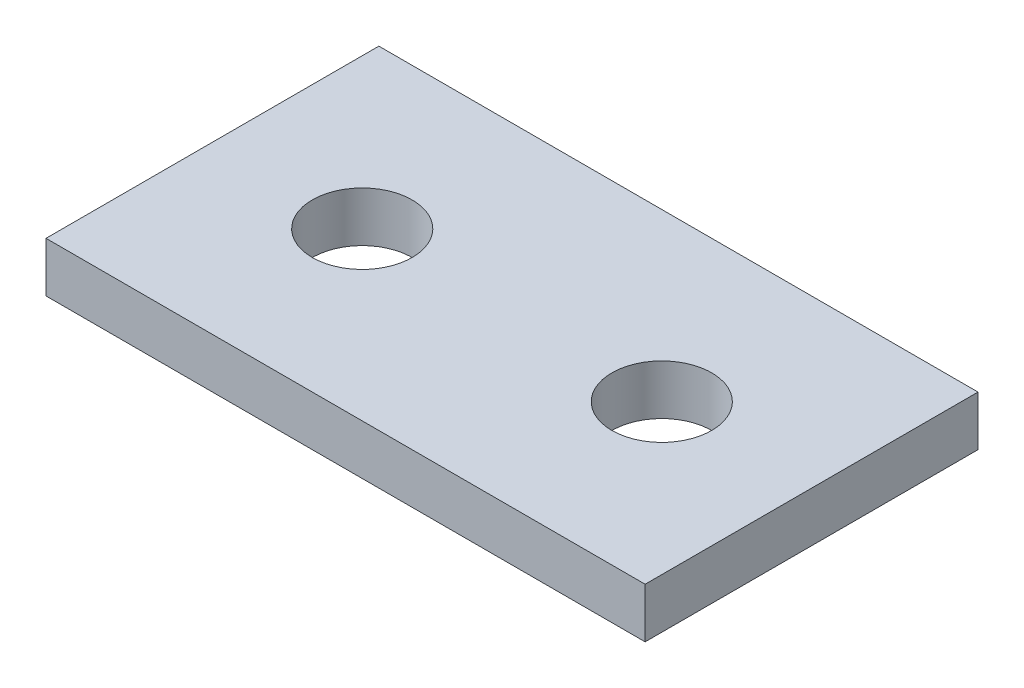
ISO-10303-21;
HEADER;
FILE_DESCRIPTION(('STEP AP214'),'2;1');
FILE_NAME('part.step','',(''),(''),'','','');
FILE_SCHEMA(('AUTOMOTIVE_DESIGN { 1 0 10303 214 1 1 1 1 }'));
ENDSEC;
DATA;
#1=APPLICATION_CONTEXT('core data for automotive mechanical design processes');
#2=APPLICATION_PROTOCOL_DEFINITION('international standard','automotive_design',2000,#1);
#3=PRODUCT_CONTEXT('',#1,'mechanical');
#4=PRODUCT('Part','Part','',(#3));
#5=PRODUCT_RELATED_PRODUCT_CATEGORY('part','',(#4));
#6=PRODUCT_DEFINITION_FORMATION('','',#4);
#7=PRODUCT_DEFINITION_CONTEXT('part definition',#1,'design');
#8=PRODUCT_DEFINITION('design','',#6,#7);
#9=PRODUCT_DEFINITION_SHAPE('','',#8);
#10=(LENGTH_UNIT() NAMED_UNIT(*) SI_UNIT(.MILLI.,.METRE.));
#11=(NAMED_UNIT(*) PLANE_ANGLE_UNIT() SI_UNIT($,.RADIAN.));
#12=(NAMED_UNIT(*) SI_UNIT($,.STERADIAN.) SOLID_ANGLE_UNIT());
#13=UNCERTAINTY_MEASURE_WITH_UNIT(LENGTH_MEASURE(1.E-05),#10,'distance_accuracy_value','');
#14=(GEOMETRIC_REPRESENTATION_CONTEXT(3) GLOBAL_UNCERTAINTY_ASSIGNED_CONTEXT((#13)) GLOBAL_UNIT_ASSIGNED_CONTEXT((#10,
#11,#12)) REPRESENTATION_CONTEXT('',''));
#15=CARTESIAN_POINT('',(0.,0.,0.));
#16=DIRECTION('',(0.,0.,1.));
#17=DIRECTION('',(1.,0.,0.));
#18=AXIS2_PLACEMENT_3D('',#15,#16,#17);
#19=CARTESIAN_POINT('',(0.,9.525,0.));
#20=DIRECTION('',(1.,0.,0.));
#21=DIRECTION('',(0.,0.,-1.));
#22=AXIS2_PLACEMENT_3D('',#19,#20,#21);
#23=PLANE('',#22);
#24=DIRECTION('',(0.,0.,1.));
#25=VECTOR('',#24,1.);
#26=CARTESIAN_POINT('',(0.,0.,0.));
#27=LINE('',#26,#25);
#28=CARTESIAN_POINT('',(0.,0.,0.));
#29=VERTEX_POINT('',#28);
#30=CARTESIAN_POINT('',(0.,0.,63.5));
#31=VERTEX_POINT('',#30);
#32=EDGE_CURVE('E97',#29,#31,#27,.T.);
#33=ORIENTED_EDGE('',*,*,#32,.T.);
#34=DIRECTION('',(0.,-1.,0.));
#35=VECTOR('',#34,1.);
#36=CARTESIAN_POINT('',(0.,9.525,63.5));
#37=LINE('',#36,#35);
#38=CARTESIAN_POINT('',(0.,9.525,63.5));
#39=VERTEX_POINT('',#38);
#40=EDGE_CURVE('E11',#39,#31,#37,.T.);
#41=ORIENTED_EDGE('',*,*,#40,.F.);
#42=DIRECTION('',(0.,0.,1.));
#43=VECTOR('',#42,1.);
#44=CARTESIAN_POINT('',(0.,9.525,0.));
#45=LINE('',#44,#43);
#46=CARTESIAN_POINT('',(0.,9.525,0.));
#47=VERTEX_POINT('',#46);
#48=EDGE_CURVE('E85',#47,#39,#45,.T.);
#49=ORIENTED_EDGE('',*,*,#48,.F.);
#50=DIRECTION('',(0.,-1.,0.));
#51=VECTOR('',#50,1.);
#52=CARTESIAN_POINT('',(0.,9.525,0.));
#53=LINE('',#52,#51);
#54=EDGE_CURVE('E93',#47,#29,#53,.T.);
#55=ORIENTED_EDGE('',*,*,#54,.T.);
#56=EDGE_LOOP('',(#33,#41,#49,#55));
#57=FACE_BOUND('',#56,.T.);
#58=ADVANCED_FACE('F34',(#57),#23,.F.);
#59=CARTESIAN_POINT('',(0.,9.525,63.5));
#60=DIRECTION('',(0.,0.,-1.));
#61=DIRECTION('',(-1.,0.,0.));
#62=AXIS2_PLACEMENT_3D('',#59,#60,#61);
#63=PLANE('',#62);
#64=DIRECTION('',(1.,0.,0.));
#65=VECTOR('',#64,1.);
#66=CARTESIAN_POINT('',(0.,0.,63.5));
#67=LINE('',#66,#65);
#68=CARTESIAN_POINT('',(114.3,0.,63.5));
#69=VERTEX_POINT('',#68);
#70=EDGE_CURVE('E89',#31,#69,#67,.T.);
#71=ORIENTED_EDGE('',*,*,#70,.T.);
#72=DIRECTION('',(0.,-1.,0.));
#73=VECTOR('',#72,1.);
#74=CARTESIAN_POINT('',(114.3,9.525,63.5));
#75=LINE('',#74,#73);
#76=CARTESIAN_POINT('',(114.3,9.525,63.5));
#77=VERTEX_POINT('',#76);
#78=EDGE_CURVE('E42',#77,#69,#75,.T.);
#79=ORIENTED_EDGE('',*,*,#78,.F.);
#80=DIRECTION('',(1.,0.,0.));
#81=VECTOR('',#80,1.);
#82=CARTESIAN_POINT('',(0.,9.525,63.5));
#83=LINE('',#82,#81);
#84=EDGE_CURVE('E80',#39,#77,#83,.T.);
#85=ORIENTED_EDGE('',*,*,#84,.F.);
#86=ORIENTED_EDGE('',*,*,#40,.T.);
#87=EDGE_LOOP('',(#71,#79,#85,#86));
#88=FACE_BOUND('',#87,.T.);
#89=ADVANCED_FACE('F88',(#88),#63,.F.);
#90=CARTESIAN_POINT('',(114.3,9.525,0.));
#91=DIRECTION('',(-1.,0.,0.));
#92=DIRECTION('',(0.,0.,1.));
#93=AXIS2_PLACEMENT_3D('',#90,#91,#92);
#94=PLANE('',#93);
#95=DIRECTION('',(0.,0.,-1.));
#96=VECTOR('',#95,1.);
#97=CARTESIAN_POINT('',(114.3,0.,0.));
#98=LINE('',#97,#96);
#99=CARTESIAN_POINT('',(114.3,0.,0.));
#100=VERTEX_POINT('',#99);
#101=EDGE_CURVE('E67',#69,#100,#98,.T.);
#102=ORIENTED_EDGE('',*,*,#101,.T.);
#103=DIRECTION('',(0.,-1.,0.));
#104=VECTOR('',#103,1.);
#105=CARTESIAN_POINT('',(114.3,9.525,0.));
#106=LINE('',#105,#104);
#107=CARTESIAN_POINT('',(114.3,9.525,0.));
#108=VERTEX_POINT('',#107);
#109=EDGE_CURVE('E90',#108,#100,#106,.T.);
#110=ORIENTED_EDGE('',*,*,#109,.F.);
#111=DIRECTION('',(0.,0.,-1.));
#112=VECTOR('',#111,1.);
#113=CARTESIAN_POINT('',(114.3,9.525,0.));
#114=LINE('',#113,#112);
#115=EDGE_CURVE('E83',#77,#108,#114,.T.);
#116=ORIENTED_EDGE('',*,*,#115,.F.);
#117=ORIENTED_EDGE('',*,*,#78,.T.);
#118=EDGE_LOOP('',(#102,#110,#116,#117));
#119=FACE_BOUND('',#118,.T.);
#120=ADVANCED_FACE('F91',(#119),#94,.F.);
#121=CARTESIAN_POINT('',(0.,9.525,0.));
#122=DIRECTION('',(0.,0.,1.));
#123=DIRECTION('',(1.,0.,0.));
#124=AXIS2_PLACEMENT_3D('',#121,#122,#123);
#125=PLANE('',#124);
#126=DIRECTION('',(-1.,0.,0.));
#127=VECTOR('',#126,1.);
#128=CARTESIAN_POINT('',(0.,0.,0.));
#129=LINE('',#128,#127);
#130=EDGE_CURVE('E73',#100,#29,#129,.T.);
#131=ORIENTED_EDGE('',*,*,#130,.T.);
#132=ORIENTED_EDGE('',*,*,#54,.F.);
#133=DIRECTION('',(-1.,0.,0.));
#134=VECTOR('',#133,1.);
#135=CARTESIAN_POINT('',(0.,9.525,0.));
#136=LINE('',#135,#134);
#137=EDGE_CURVE('E50',#108,#47,#136,.T.);
#138=ORIENTED_EDGE('',*,*,#137,.F.);
#139=ORIENTED_EDGE('',*,*,#109,.T.);
#140=EDGE_LOOP('',(#131,#132,#138,#139));
#141=FACE_BOUND('',#140,.T.);
#142=ADVANCED_FACE('F105',(#141),#125,.F.);
#143=CARTESIAN_POINT('',(0.,9.525,0.));
#144=DIRECTION('',(0.,1.,0.));
#145=DIRECTION('',(0.,0.,1.));
#146=AXIS2_PLACEMENT_3D('',#143,#144,#145);
#147=PLANE('',#146);
#148=CARTESIAN_POINT('',(85.725,9.525,31.75));
#149=DIRECTION('',(0.,1.,0.));
#150=DIRECTION('',(0.,0.,-1.));
#151=AXIS2_PLACEMENT_3D('',#148,#149,#150);
#152=CIRCLE('',#151,9.52499999999999);
#153=CARTESIAN_POINT('',(85.725,9.525,41.275));
#154=VERTEX_POINT('',#153);
#155=EDGE_CURVE('E117',#154,#154,#152,.T.);
#156=ORIENTED_EDGE('',*,*,#155,.F.);
#157=EDGE_LOOP('',(#156));
#158=FACE_BOUND('',#157,.T.);
#159=CARTESIAN_POINT('',(28.575,9.525,31.75));
#160=DIRECTION('',(0.,1.,0.));
#161=DIRECTION('',(0.,0.,1.));
#162=AXIS2_PLACEMENT_3D('',#159,#160,#161);
#163=CIRCLE('',#162,9.525);
#164=CARTESIAN_POINT('',(28.575,9.525,41.275));
#165=VERTEX_POINT('',#164);
#166=EDGE_CURVE('E111',#165,#165,#163,.T.);
#167=ORIENTED_EDGE('',*,*,#166,.F.);
#168=EDGE_LOOP('',(#167));
#169=FACE_BOUND('',#168,.T.);
#170=ORIENTED_EDGE('',*,*,#48,.T.);
#171=ORIENTED_EDGE('',*,*,#84,.T.);
#172=ORIENTED_EDGE('',*,*,#115,.T.);
#173=ORIENTED_EDGE('',*,*,#137,.T.);
#174=EDGE_LOOP('',(#170,#171,#172,#173));
#175=FACE_BOUND('',#174,.T.);
#176=ADVANCED_FACE('F81',(#158,#169,#175),#147,.T.);
#177=CARTESIAN_POINT('',(0.,0.,0.));
#178=DIRECTION('',(0.,1.,0.));
#179=DIRECTION('',(0.,0.,1.));
#180=AXIS2_PLACEMENT_3D('',#177,#178,#179);
#181=PLANE('',#180);
#182=CARTESIAN_POINT('',(85.725,0.,31.75));
#183=DIRECTION('',(0.,1.,0.));
#184=DIRECTION('',(0.,0.,-1.));
#185=AXIS2_PLACEMENT_3D('',#182,#183,#184);
#186=CIRCLE('',#185,9.52499999999999);
#187=CARTESIAN_POINT('',(85.725,0.,41.275));
#188=VERTEX_POINT('',#187);
#189=EDGE_CURVE('E114',#188,#188,#186,.T.);
#190=ORIENTED_EDGE('',*,*,#189,.T.);
#191=EDGE_LOOP('',(#190));
#192=FACE_BOUND('',#191,.T.);
#193=CARTESIAN_POINT('',(28.575,0.,31.75));
#194=DIRECTION('',(0.,1.,0.));
#195=DIRECTION('',(0.,0.,1.));
#196=AXIS2_PLACEMENT_3D('',#193,#194,#195);
#197=CIRCLE('',#196,9.525);
#198=CARTESIAN_POINT('',(28.575,0.,41.275));
#199=VERTEX_POINT('',#198);
#200=EDGE_CURVE('E100',#199,#199,#197,.T.);
#201=ORIENTED_EDGE('',*,*,#200,.T.);
#202=EDGE_LOOP('',(#201));
#203=FACE_BOUND('',#202,.T.);
#204=ORIENTED_EDGE('',*,*,#32,.F.);
#205=ORIENTED_EDGE('',*,*,#130,.F.);
#206=ORIENTED_EDGE('',*,*,#101,.F.);
#207=ORIENTED_EDGE('',*,*,#70,.F.);
#208=EDGE_LOOP('',(#204,#205,#206,#207));
#209=FACE_BOUND('',#208,.T.);
#210=ADVANCED_FACE('F108',(#192,#203,#209),#181,.F.);
#211=CARTESIAN_POINT('',(28.575,0.,31.75));
#212=DIRECTION('',(0.,1.,0.));
#213=DIRECTION('',(0.,0.,1.));
#214=AXIS2_PLACEMENT_3D('',#211,#212,#213);
#215=CYLINDRICAL_SURFACE('',#214,9.525);
#216=CARTESIAN_POINT('',(28.575,0.,41.275));
#217=CARTESIAN_POINT('',(28.575,0.0992187499999999,41.275));
#218=CARTESIAN_POINT('',(28.575,0.1984375,41.275));
#219=CARTESIAN_POINT('',(28.575,0.396875,41.275));
#220=CARTESIAN_POINT('',(28.575,0.49609375,41.275));
#221=CARTESIAN_POINT('',(28.575,0.69453125,41.275));
#222=CARTESIAN_POINT('',(28.575,0.79375,41.275));
#223=CARTESIAN_POINT('',(28.575,0.9921875,41.275));
#224=CARTESIAN_POINT('',(28.575,1.09140625,41.275));
#225=CARTESIAN_POINT('',(28.575,1.28984375,41.275));
#226=CARTESIAN_POINT('',(28.575,1.3890625,41.275));
#227=CARTESIAN_POINT('',(28.575,1.5875,41.275));
#228=CARTESIAN_POINT('',(28.575,1.68671875,41.275));
#229=CARTESIAN_POINT('',(28.575,1.88515625,41.275));
#230=CARTESIAN_POINT('',(28.575,1.984375,41.275));
#231=CARTESIAN_POINT('',(28.575,2.1828125,41.275));
#232=CARTESIAN_POINT('',(28.575,2.28203125,41.275));
#233=CARTESIAN_POINT('',(28.575,2.48046875,41.275));
#234=CARTESIAN_POINT('',(28.575,2.5796875,41.275));
#235=CARTESIAN_POINT('',(28.575,2.778125,41.275));
#236=CARTESIAN_POINT('',(28.575,2.87734375,41.275));
#237=CARTESIAN_POINT('',(28.575,3.07578125,41.275));
#238=CARTESIAN_POINT('',(28.575,3.175,41.275));
#239=CARTESIAN_POINT('',(28.575,3.3734375,41.275));
#240=CARTESIAN_POINT('',(28.575,3.47265625,41.275));
#241=CARTESIAN_POINT('',(28.575,3.67109375,41.275));
#242=CARTESIAN_POINT('',(28.575,3.7703125,41.275));
#243=CARTESIAN_POINT('',(28.575,3.96875,41.275));
#244=CARTESIAN_POINT('',(28.575,4.06796875,41.275));
#245=CARTESIAN_POINT('',(28.575,4.26640625,41.275));
#246=CARTESIAN_POINT('',(28.575,4.365625,41.275));
#247=CARTESIAN_POINT('',(28.575,4.5640625,41.275));
#248=CARTESIAN_POINT('',(28.575,4.66328125,41.275));
#249=CARTESIAN_POINT('',(28.575,4.86171875,41.275));
#250=CARTESIAN_POINT('',(28.575,4.9609375,41.275));
#251=CARTESIAN_POINT('',(28.575,5.159375,41.275));
#252=CARTESIAN_POINT('',(28.575,5.25859375,41.275));
#253=CARTESIAN_POINT('',(28.575,5.45703125,41.275));
#254=CARTESIAN_POINT('',(28.575,5.55625,41.275));
#255=CARTESIAN_POINT('',(28.575,5.7546875,41.275));
#256=CARTESIAN_POINT('',(28.575,5.85390625,41.275));
#257=CARTESIAN_POINT('',(28.575,6.05234375,41.275));
#258=CARTESIAN_POINT('',(28.575,6.1515625,41.275));
#259=CARTESIAN_POINT('',(28.575,6.35,41.275));
#260=CARTESIAN_POINT('',(28.575,6.44921875,41.275));
#261=CARTESIAN_POINT('',(28.575,6.64765625,41.275));
#262=CARTESIAN_POINT('',(28.575,6.746875,41.275));
#263=CARTESIAN_POINT('',(28.575,6.9453125,41.275));
#264=CARTESIAN_POINT('',(28.575,7.04453125,41.275));
#265=CARTESIAN_POINT('',(28.575,7.24296875,41.275));
#266=CARTESIAN_POINT('',(28.575,7.3421875,41.275));
#267=CARTESIAN_POINT('',(28.575,7.540625,41.275));
#268=CARTESIAN_POINT('',(28.575,7.63984375,41.275));
#269=CARTESIAN_POINT('',(28.575,7.83828125,41.275));
#270=CARTESIAN_POINT('',(28.575,7.9375,41.275));
#271=CARTESIAN_POINT('',(28.575,8.1359375,41.275));
#272=CARTESIAN_POINT('',(28.575,8.23515625,41.275));
#273=CARTESIAN_POINT('',(28.575,8.43359375,41.275));
#274=CARTESIAN_POINT('',(28.575,8.5328125,41.275));
#275=CARTESIAN_POINT('',(28.575,8.73125,41.275));
#276=CARTESIAN_POINT('',(28.575,8.83046875,41.275));
#277=CARTESIAN_POINT('',(28.575,9.02890625,41.275));
#278=CARTESIAN_POINT('',(28.575,9.128125,41.275));
#279=CARTESIAN_POINT('',(28.575,9.3265625,41.275));
#280=CARTESIAN_POINT('',(28.575,9.42578125,41.275));
#281=CARTESIAN_POINT('',(28.575,9.525,41.275));
#282=B_SPLINE_CURVE_WITH_KNOTS('',3,(#216,#217,#218,#219,#220,#221,#222,#223,#224,#225,#226,
#227,#228,#229,#230,#231,#232,#233,#234,#235,#236,#237,#238,#239,#240,#241,#242,#243,#244,#245,
#246,#247,#248,#249,#250,#251,#252,#253,#254,#255,#256,#257,#258,#259,#260,#261,#262,#263,#264,
#265,#266,#267,#268,#269,#270,#271,#272,#273,#274,#275,#276,#277,#278,#279,#280,#281),
.UNSPECIFIED.,.F.,.F.,(4,2,2,2,2,2,2,2,2,2,2,2,2,2,2,2,2,2,2,2,2,2,2,2,2,2,2,2,2,2,2,2,4),(0.,
0.29765625,0.5953125,0.89296875,1.190625,1.48828125,1.7859375,2.08359375,2.38125,2.67890625,
2.9765625,3.27421875,3.571875,3.86953125,4.1671875,4.46484375,4.7625,5.06015625,5.3578125,
5.65546875,5.953125,6.25078125,6.5484375,6.84609375,7.14375,7.44140625,7.7390625,8.03671875,
8.334375,8.63203125,8.9296875,9.22734375,9.525),.UNSPECIFIED.);
#283=EDGE_CURVE('BSEAM128',#199,#165,#282,.T.);
#284=ORIENTED_EDGE('',*,*,#200,.F.);
#285=ORIENTED_EDGE('',*,*,#166,.T.);
#286=ORIENTED_EDGE('',*,*,#283,.T.);
#287=ORIENTED_EDGE('',*,*,#283,.F.);
#288=EDGE_LOOP('',(#284,#286,#285,#287));
#289=FACE_BOUND('',#288,.T.);
#290=ADVANCED_FACE('F128',(#289),#215,.F.);
#291=CARTESIAN_POINT('',(85.725,0.,31.75));
#292=DIRECTION('',(0.,1.,0.));
#293=DIRECTION('',(0.,0.,1.));
#294=AXIS2_PLACEMENT_3D('',#291,#292,#293);
#295=CYLINDRICAL_SURFACE('',#294,9.52499999999999);
#296=CARTESIAN_POINT('',(85.725,0.,41.275));
#297=CARTESIAN_POINT('',(85.725,0.0992187499999999,41.275));
#298=CARTESIAN_POINT('',(85.725,0.1984375,41.275));
#299=CARTESIAN_POINT('',(85.725,0.396875,41.275));
#300=CARTESIAN_POINT('',(85.725,0.49609375,41.275));
#301=CARTESIAN_POINT('',(85.725,0.69453125,41.275));
#302=CARTESIAN_POINT('',(85.725,0.79375,41.275));
#303=CARTESIAN_POINT('',(85.725,0.9921875,41.275));
#304=CARTESIAN_POINT('',(85.725,1.09140625,41.275));
#305=CARTESIAN_POINT('',(85.725,1.28984375,41.275));
#306=CARTESIAN_POINT('',(85.725,1.3890625,41.275));
#307=CARTESIAN_POINT('',(85.725,1.5875,41.275));
#308=CARTESIAN_POINT('',(85.725,1.68671875,41.275));
#309=CARTESIAN_POINT('',(85.725,1.88515625,41.275));
#310=CARTESIAN_POINT('',(85.725,1.984375,41.275));
#311=CARTESIAN_POINT('',(85.725,2.1828125,41.275));
#312=CARTESIAN_POINT('',(85.725,2.28203125,41.275));
#313=CARTESIAN_POINT('',(85.725,2.48046875,41.275));
#314=CARTESIAN_POINT('',(85.725,2.5796875,41.275));
#315=CARTESIAN_POINT('',(85.725,2.778125,41.275));
#316=CARTESIAN_POINT('',(85.725,2.87734375,41.275));
#317=CARTESIAN_POINT('',(85.725,3.07578125,41.275));
#318=CARTESIAN_POINT('',(85.725,3.175,41.275));
#319=CARTESIAN_POINT('',(85.725,3.3734375,41.275));
#320=CARTESIAN_POINT('',(85.725,3.47265625,41.275));
#321=CARTESIAN_POINT('',(85.725,3.67109375,41.275));
#322=CARTESIAN_POINT('',(85.725,3.7703125,41.275));
#323=CARTESIAN_POINT('',(85.725,3.96875,41.275));
#324=CARTESIAN_POINT('',(85.725,4.06796875,41.275));
#325=CARTESIAN_POINT('',(85.725,4.26640625,41.275));
#326=CARTESIAN_POINT('',(85.725,4.365625,41.275));
#327=CARTESIAN_POINT('',(85.725,4.5640625,41.275));
#328=CARTESIAN_POINT('',(85.725,4.66328125,41.275));
#329=CARTESIAN_POINT('',(85.725,4.86171875,41.275));
#330=CARTESIAN_POINT('',(85.725,4.9609375,41.275));
#331=CARTESIAN_POINT('',(85.725,5.159375,41.275));
#332=CARTESIAN_POINT('',(85.725,5.25859375,41.275));
#333=CARTESIAN_POINT('',(85.725,5.45703125,41.275));
#334=CARTESIAN_POINT('',(85.725,5.55625,41.275));
#335=CARTESIAN_POINT('',(85.725,5.7546875,41.275));
#336=CARTESIAN_POINT('',(85.725,5.85390625,41.275));
#337=CARTESIAN_POINT('',(85.725,6.05234375,41.275));
#338=CARTESIAN_POINT('',(85.725,6.1515625,41.275));
#339=CARTESIAN_POINT('',(85.725,6.35,41.275));
#340=CARTESIAN_POINT('',(85.725,6.44921875,41.275));
#341=CARTESIAN_POINT('',(85.725,6.64765625,41.275));
#342=CARTESIAN_POINT('',(85.725,6.746875,41.275));
#343=CARTESIAN_POINT('',(85.725,6.9453125,41.275));
#344=CARTESIAN_POINT('',(85.725,7.04453125,41.275));
#345=CARTESIAN_POINT('',(85.725,7.24296875,41.275));
#346=CARTESIAN_POINT('',(85.725,7.3421875,41.275));
#347=CARTESIAN_POINT('',(85.725,7.540625,41.275));
#348=CARTESIAN_POINT('',(85.725,7.63984375,41.275));
#349=CARTESIAN_POINT('',(85.725,7.83828125,41.275));
#350=CARTESIAN_POINT('',(85.725,7.9375,41.275));
#351=CARTESIAN_POINT('',(85.725,8.1359375,41.275));
#352=CARTESIAN_POINT('',(85.725,8.23515625,41.275));
#353=CARTESIAN_POINT('',(85.725,8.43359375,41.275));
#354=CARTESIAN_POINT('',(85.725,8.5328125,41.275));
#355=CARTESIAN_POINT('',(85.725,8.73125,41.275));
#356=CARTESIAN_POINT('',(85.725,8.83046875,41.275));
#357=CARTESIAN_POINT('',(85.725,9.02890625,41.275));
#358=CARTESIAN_POINT('',(85.725,9.128125,41.275));
#359=CARTESIAN_POINT('',(85.725,9.3265625,41.275));
#360=CARTESIAN_POINT('',(85.725,9.42578125,41.275));
#361=CARTESIAN_POINT('',(85.725,9.525,41.275));
#362=B_SPLINE_CURVE_WITH_KNOTS('',3,(#296,#297,#298,#299,#300,#301,#302,#303,#304,#305,#306,
#307,#308,#309,#310,#311,#312,#313,#314,#315,#316,#317,#318,#319,#320,#321,#322,#323,#324,#325,
#326,#327,#328,#329,#330,#331,#332,#333,#334,#335,#336,#337,#338,#339,#340,#341,#342,#343,#344,
#345,#346,#347,#348,#349,#350,#351,#352,#353,#354,#355,#356,#357,#358,#359,#360,#361),
.UNSPECIFIED.,.F.,.F.,(4,2,2,2,2,2,2,2,2,2,2,2,2,2,2,2,2,2,2,2,2,2,2,2,2,2,2,2,2,2,2,2,4),(0.,
0.29765625,0.5953125,0.89296875,1.190625,1.48828125,1.7859375,2.08359375,2.38125,2.67890625,
2.9765625,3.27421875,3.571875,3.86953125,4.1671875,4.46484375,4.7625,5.06015625,5.3578125,
5.65546875,5.953125,6.25078125,6.5484375,6.84609375,7.14375,7.44140625,7.7390625,8.03671875,
8.334375,8.63203125,8.9296875,9.22734375,9.525),.UNSPECIFIED.);
#363=EDGE_CURVE('BSEAM125',#188,#154,#362,.T.);
#364=ORIENTED_EDGE('',*,*,#189,.F.);
#365=ORIENTED_EDGE('',*,*,#155,.T.);
#366=ORIENTED_EDGE('',*,*,#363,.T.);
#367=ORIENTED_EDGE('',*,*,#363,.F.);
#368=EDGE_LOOP('',(#364,#366,#365,#367));
#369=FACE_BOUND('',#368,.T.);
#370=ADVANCED_FACE('F125',(#369),#295,.F.);
#371=CLOSED_SHELL('',(#58,#89,#120,#142,#176,#210,#290,#370));
#372=MANIFOLD_SOLID_BREP('B2',#371);
#373=ADVANCED_BREP_SHAPE_REPRESENTATION('',(#18,#372),#14);
#374=SHAPE_DEFINITION_REPRESENTATION(#9,#373);
ENDSEC;
END-ISO-10303-21;
